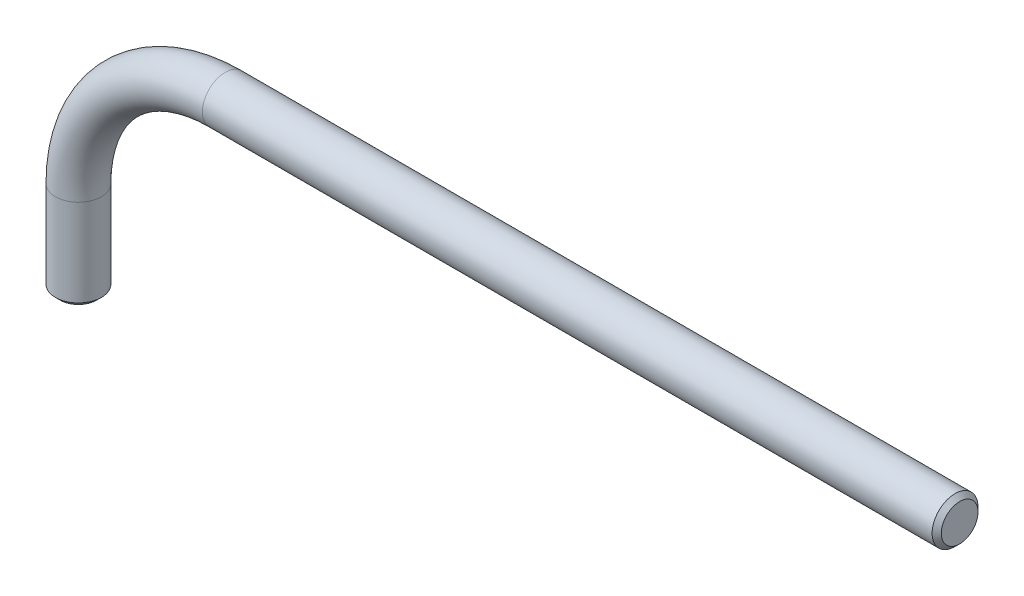
ISO-10303-21;
HEADER;
FILE_DESCRIPTION(('STEP AP214'),'2;1');
FILE_NAME('part.step','',(''),(''),'','','');
FILE_SCHEMA(('AUTOMOTIVE_DESIGN { 1 0 10303 214 1 1 1 1 }'));
ENDSEC;
DATA;
#1=APPLICATION_CONTEXT('core data for automotive mechanical design processes');
#2=APPLICATION_PROTOCOL_DEFINITION('international standard','automotive_design',2000,#1);
#3=PRODUCT_CONTEXT('',#1,'mechanical');
#4=PRODUCT('Part','Part','',(#3));
#5=PRODUCT_RELATED_PRODUCT_CATEGORY('part','',(#4));
#6=PRODUCT_DEFINITION_FORMATION('','',#4);
#7=PRODUCT_DEFINITION_CONTEXT('part definition',#1,'design');
#8=PRODUCT_DEFINITION('design','',#6,#7);
#9=PRODUCT_DEFINITION_SHAPE('','',#8);
#10=(LENGTH_UNIT() NAMED_UNIT(*) SI_UNIT(.MILLI.,.METRE.));
#11=(NAMED_UNIT(*) PLANE_ANGLE_UNIT() SI_UNIT($,.RADIAN.));
#12=(NAMED_UNIT(*) SI_UNIT($,.STERADIAN.) SOLID_ANGLE_UNIT());
#13=UNCERTAINTY_MEASURE_WITH_UNIT(LENGTH_MEASURE(1.E-05),#10,'distance_accuracy_value','');
#14=(GEOMETRIC_REPRESENTATION_CONTEXT(3) GLOBAL_UNCERTAINTY_ASSIGNED_CONTEXT((#13)) GLOBAL_UNIT_ASSIGNED_CONTEXT((#10,
#11,#12)) REPRESENTATION_CONTEXT('',''));
#15=CARTESIAN_POINT('',(0.,0.,0.));
#16=DIRECTION('',(0.,0.,1.));
#17=DIRECTION('',(1.,0.,0.));
#18=AXIS2_PLACEMENT_3D('',#15,#16,#17);
#19=CARTESIAN_POINT('',(0.,0.,0.));
#20=DIRECTION('',(0.,1.,0.));
#21=DIRECTION('',(0.,0.,1.));
#22=AXIS2_PLACEMENT_3D('',#19,#20,#21);
#23=PLANE('',#22);
#24=CARTESIAN_POINT('',(0.,0.,0.));
#25=DIRECTION('',(0.,1.,0.));
#26=DIRECTION('',(0.,0.,1.));
#27=AXIS2_PLACEMENT_3D('',#24,#25,#26);
#28=CIRCLE('',#27,2.);
#29=CARTESIAN_POINT('',(0.,0.,2.));
#30=VERTEX_POINT('',#29);
#31=EDGE_CURVE('E10',#30,#30,#28,.F.);
#32=ORIENTED_EDGE('',*,*,#31,.T.);
#33=EDGE_LOOP('',(#32));
#34=FACE_BOUND('',#33,.T.);
#35=ADVANCED_FACE('F45',(#34),#23,.F.);
#36=CARTESIAN_POINT('',(96.,26.,0.));
#37=DIRECTION('',(1.,0.,0.));
#38=DIRECTION('',(0.,0.,1.));
#39=AXIS2_PLACEMENT_3D('',#36,#37,#38);
#40=PLANE('',#39);
#41=CARTESIAN_POINT('',(96.,26.,0.));
#42=DIRECTION('',(1.,0.,0.));
#43=DIRECTION('',(0.,1.,0.));
#44=AXIS2_PLACEMENT_3D('',#41,#42,#43);
#45=CIRCLE('',#44,2.);
#46=CARTESIAN_POINT('',(96.,28.,0.));
#47=VERTEX_POINT('',#46);
#48=EDGE_CURVE('E64',#47,#47,#45,.T.);
#49=ORIENTED_EDGE('',*,*,#48,.T.);
#50=EDGE_LOOP('',(#49));
#51=FACE_BOUND('',#50,.T.);
#52=ADVANCED_FACE('F83',(#51),#40,.T.);
#53=CARTESIAN_POINT('',(0.,0.,0.));
#54=DIRECTION('',(0.,1.,0.));
#55=DIRECTION('',(0.,0.,1.));
#56=AXIS2_PLACEMENT_3D('',#53,#54,#55);
#57=CYLINDRICAL_SURFACE('',#56,2.5);
#58=CARTESIAN_POINT('',(0.,0.500000000000003,0.));
#59=DIRECTION('',(0.,1.,0.));
#60=DIRECTION('',(0.,0.,1.));
#61=AXIS2_PLACEMENT_3D('',#58,#59,#60);
#62=CIRCLE('',#61,2.5);
#63=CARTESIAN_POINT('',(0.,0.500000000000003,2.5));
#64=VERTEX_POINT('',#63);
#65=EDGE_CURVE('E54',#64,#64,#62,.T.);
#66=ORIENTED_EDGE('',*,*,#65,.T.);
#67=EDGE_LOOP('',(#66));
#68=FACE_BOUND('',#67,.T.);
#69=CARTESIAN_POINT('',(0.,10.,0.));
#70=DIRECTION('',(0.,1.,0.));
#71=DIRECTION('',(0.,0.,1.));
#72=AXIS2_PLACEMENT_3D('',#69,#70,#71);
#73=CIRCLE('',#72,2.5);
#74=CARTESIAN_POINT('',(-2.5,10.,0.));
#75=VERTEX_POINT('',#74);
#76=EDGE_CURVE('E74',#75,#75,#73,.T.);
#77=ORIENTED_EDGE('',*,*,#76,.F.);
#78=EDGE_LOOP('',(#77));
#79=FACE_BOUND('',#78,.T.);
#80=ADVANCED_FACE('F81',(#68,#79),#57,.T.);
#81=CARTESIAN_POINT('',(16.,10.,0.));
#82=DIRECTION('',(0.,0.,-1.));
#83=DIRECTION('',(-1.,0.,0.));
#84=AXIS2_PLACEMENT_3D('',#81,#82,#83);
#85=TOROIDAL_SURFACE('',#84,16.,2.5);
#86=CARTESIAN_POINT('',(16.,26.,0.));
#87=DIRECTION('',(1.,0.,0.));
#88=DIRECTION('',(0.,0.,1.));
#89=AXIS2_PLACEMENT_3D('',#86,#87,#88);
#90=CIRCLE('',#89,2.5);
#91=CARTESIAN_POINT('',(16.,28.5,0.));
#92=VERTEX_POINT('',#91);
#93=EDGE_CURVE('E70',#92,#92,#90,.T.);
#94=CARTESIAN_POINT('',(16.,10.,0.));
#95=DIRECTION('',(0.,0.,-1.));
#96=DIRECTION('',(-1.,0.,0.));
#97=AXIS2_PLACEMENT_3D('',#94,#95,#96);
#98=CIRCLE('',#97,18.5);
#99=EDGE_CURVE('',#75,#92,#98,.T.);
#100=ORIENTED_EDGE('',*,*,#76,.T.);
#101=ORIENTED_EDGE('',*,*,#93,.F.);
#102=ORIENTED_EDGE('',*,*,#99,.T.);
#103=ORIENTED_EDGE('',*,*,#99,.F.);
#104=EDGE_LOOP('',(#100,#102,#101,#103));
#105=FACE_BOUND('',#104,.T.);
#106=ADVANCED_FACE('F79',(#105),#85,.T.);
#107=CARTESIAN_POINT('',(16.,26.,0.));
#108=DIRECTION('',(1.,0.,0.));
#109=DIRECTION('',(0.,1.,0.));
#110=AXIS2_PLACEMENT_3D('',#107,#108,#109);
#111=CYLINDRICAL_SURFACE('',#110,2.5);
#112=CARTESIAN_POINT('',(95.5,26.,0.));
#113=DIRECTION('',(1.,0.,0.));
#114=DIRECTION('',(0.,0.,-1.));
#115=AXIS2_PLACEMENT_3D('',#112,#113,#114);
#116=CIRCLE('',#115,2.5);
#117=CARTESIAN_POINT('',(95.5,26.,-2.5));
#118=VERTEX_POINT('',#117);
#119=EDGE_CURVE('E59',#118,#118,#116,.F.);
#120=ORIENTED_EDGE('',*,*,#119,.T.);
#121=EDGE_LOOP('',(#120));
#122=FACE_BOUND('',#121,.T.);
#123=ORIENTED_EDGE('',*,*,#93,.T.);
#124=EDGE_LOOP('',(#123));
#125=FACE_BOUND('',#124,.T.);
#126=ADVANCED_FACE('F90',(#122,#125),#111,.T.);
#127=CARTESIAN_POINT('',(96.,26.,0.));
#128=DIRECTION('',(-1.,0.,0.));
#129=DIRECTION('',(0.,0.,1.));
#130=AXIS2_PLACEMENT_3D('',#127,#128,#129);
#131=CONICAL_SURFACE('',#130,2.,0.785398163397446);
#132=ORIENTED_EDGE('',*,*,#119,.F.);
#133=EDGE_LOOP('',(#132));
#134=FACE_BOUND('',#133,.T.);
#135=ORIENTED_EDGE('',*,*,#48,.F.);
#136=EDGE_LOOP('',(#135));
#137=FACE_BOUND('',#136,.T.);
#138=ADVANCED_FACE('F95',(#134,#137),#131,.T.);
#139=CARTESIAN_POINT('',(0.,0.500000000000003,0.));
#140=DIRECTION('',(0.,1.,0.));
#141=DIRECTION('',(0.,0.,1.));
#142=AXIS2_PLACEMENT_3D('',#139,#140,#141);
#143=CONICAL_SURFACE('',#142,2.5,0.785398163397443);
#144=ORIENTED_EDGE('',*,*,#31,.F.);
#145=EDGE_LOOP('',(#144));
#146=FACE_BOUND('',#145,.T.);
#147=ORIENTED_EDGE('',*,*,#65,.F.);
#148=EDGE_LOOP('',(#147));
#149=FACE_BOUND('',#148,.T.);
#150=ADVANCED_FACE('F48',(#146,#149),#143,.T.);
#151=CLOSED_SHELL('',(#35,#52,#80,#106,#126,#138,#150));
#152=MANIFOLD_SOLID_BREP('B2',#151);
#153=ADVANCED_BREP_SHAPE_REPRESENTATION('',(#18,#152),#14);
#154=SHAPE_DEFINITION_REPRESENTATION(#9,#153);
ENDSEC;
END-ISO-10303-21;
